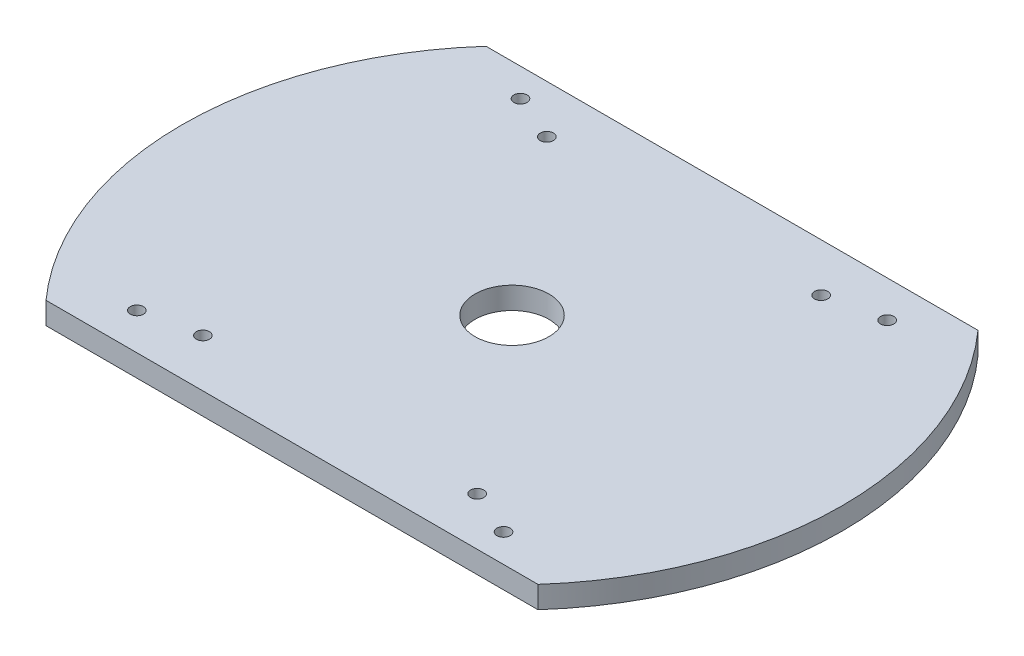
ISO-10303-21;
HEADER;
FILE_DESCRIPTION(('STEP AP214'),'2;1');
FILE_NAME('part.step','',(''),(''),'','','');
FILE_SCHEMA(('AUTOMOTIVE_DESIGN { 1 0 10303 214 1 1 1 1 }'));
ENDSEC;
DATA;
#1=APPLICATION_CONTEXT('core data for automotive mechanical design processes');
#2=APPLICATION_PROTOCOL_DEFINITION('international standard','automotive_design',2000,#1);
#3=PRODUCT_CONTEXT('',#1,'mechanical');
#4=PRODUCT('Part','Part','',(#3));
#5=PRODUCT_RELATED_PRODUCT_CATEGORY('part','',(#4));
#6=PRODUCT_DEFINITION_FORMATION('','',#4);
#7=PRODUCT_DEFINITION_CONTEXT('part definition',#1,'design');
#8=PRODUCT_DEFINITION('design','',#6,#7);
#9=PRODUCT_DEFINITION_SHAPE('','',#8);
#10=(LENGTH_UNIT() NAMED_UNIT(*) SI_UNIT(.MILLI.,.METRE.));
#11=(NAMED_UNIT(*) PLANE_ANGLE_UNIT() SI_UNIT($,.RADIAN.));
#12=(NAMED_UNIT(*) SI_UNIT($,.STERADIAN.) SOLID_ANGLE_UNIT());
#13=UNCERTAINTY_MEASURE_WITH_UNIT(LENGTH_MEASURE(1.E-05),#10,'distance_accuracy_value','');
#14=(GEOMETRIC_REPRESENTATION_CONTEXT(3) GLOBAL_UNCERTAINTY_ASSIGNED_CONTEXT((#13)) GLOBAL_UNIT_ASSIGNED_CONTEXT((#10,
#11,#12)) REPRESENTATION_CONTEXT('',''));
#15=CARTESIAN_POINT('',(0.,0.,0.));
#16=DIRECTION('',(0.,0.,1.));
#17=DIRECTION('',(1.,0.,0.));
#18=AXIS2_PLACEMENT_3D('',#15,#16,#17);
#19=CARTESIAN_POINT('',(0.,5.,0.));
#20=DIRECTION('',(0.,-1.,0.));
#21=DIRECTION('',(0.,0.,-1.));
#22=AXIS2_PLACEMENT_3D('',#19,#20,#21);
#23=CYLINDRICAL_SURFACE('',#22,75.);
#24=DIRECTION('',(0.,1.,0.));
#25=VECTOR('',#24,1.);
#26=CARTESIAN_POINT('',(55.9016994374948,-5.,-50.));
#27=LINE('',#26,#25);
#28=CARTESIAN_POINT('',(55.9016994374948,0.,-50.));
#29=VERTEX_POINT('',#28);
#30=CARTESIAN_POINT('',(55.9016994374948,5.,-50.));
#31=VERTEX_POINT('',#30);
#32=EDGE_CURVE('E64',#29,#31,#27,.T.);
#33=ORIENTED_EDGE('',*,*,#32,.T.);
#34=CARTESIAN_POINT('',(0.,5.,0.));
#35=DIRECTION('',(0.,1.,0.));
#36=DIRECTION('',(0.,0.,1.));
#37=AXIS2_PLACEMENT_3D('',#34,#35,#36);
#38=CIRCLE('',#37,75.);
#39=CARTESIAN_POINT('',(55.9016994374948,5.,50.));
#40=VERTEX_POINT('',#39);
#41=EDGE_CURVE('E95',#40,#31,#38,.T.);
#42=ORIENTED_EDGE('',*,*,#41,.F.);
#43=DIRECTION('',(0.,1.,0.));
#44=VECTOR('',#43,1.);
#45=CARTESIAN_POINT('',(55.9016994374948,-5.,50.));
#46=LINE('',#45,#44);
#47=CARTESIAN_POINT('',(55.9016994374948,0.,50.));
#48=VERTEX_POINT('',#47);
#49=EDGE_CURVE('E89',#48,#40,#46,.T.);
#50=ORIENTED_EDGE('',*,*,#49,.F.);
#51=CARTESIAN_POINT('',(0.,0.,0.));
#52=DIRECTION('',(0.,1.,0.));
#53=DIRECTION('',(0.,0.,1.));
#54=AXIS2_PLACEMENT_3D('',#51,#52,#53);
#55=CIRCLE('',#54,75.);
#56=EDGE_CURVE('E97',#48,#29,#55,.T.);
#57=ORIENTED_EDGE('',*,*,#56,.T.);
#58=EDGE_LOOP('',(#33,#42,#50,#57));
#59=FACE_BOUND('',#58,.T.);
#60=ADVANCED_FACE('F41',(#59),#23,.T.);
#61=DIRECTION('',(0.,1.,0.));
#62=VECTOR('',#61,1.);
#63=CARTESIAN_POINT('',(-55.9016994374948,-5.,-50.));
#64=LINE('',#63,#62);
#65=CARTESIAN_POINT('',(-55.9016994374948,0.,-50.));
#66=VERTEX_POINT('',#65);
#67=CARTESIAN_POINT('',(-55.9016994374948,5.,-50.));
#68=VERTEX_POINT('',#67);
#69=EDGE_CURVE('E83',#66,#68,#64,.T.);
#70=ORIENTED_EDGE('',*,*,#69,.F.);
#71=CARTESIAN_POINT('',(-55.9016994374948,0.,50.));
#72=VERTEX_POINT('',#71);
#73=EDGE_CURVE('E147',#66,#72,#55,.T.);
#74=ORIENTED_EDGE('',*,*,#73,.T.);
#75=DIRECTION('',(0.,1.,0.));
#76=VECTOR('',#75,1.);
#77=CARTESIAN_POINT('',(-55.9016994374948,-5.,50.));
#78=LINE('',#77,#76);
#79=CARTESIAN_POINT('',(-55.9016994374948,5.,50.));
#80=VERTEX_POINT('',#79);
#81=EDGE_CURVE('E57',#72,#80,#78,.T.);
#82=ORIENTED_EDGE('',*,*,#81,.T.);
#83=EDGE_CURVE('E105',#68,#80,#38,.T.);
#84=ORIENTED_EDGE('',*,*,#83,.F.);
#85=EDGE_LOOP('',(#70,#74,#82,#84));
#86=FACE_BOUND('',#85,.T.);
#87=ADVANCED_FACE('F167',(#86),#23,.T.);
#88=CARTESIAN_POINT('',(0.,5.,0.));
#89=DIRECTION('',(0.,1.,0.));
#90=DIRECTION('',(0.,0.,1.));
#91=AXIS2_PLACEMENT_3D('',#88,#89,#90);
#92=PLANE('',#91);
#93=CARTESIAN_POINT('',(31.164692583251,5.,-39.0906342227684));
#94=DIRECTION('',(0.,1.,0.));
#95=DIRECTION('',(0.,0.,1.));
#96=AXIS2_PLACEMENT_3D('',#93,#94,#95);
#97=CIRCLE('',#96,1.5);
#98=CARTESIAN_POINT('',(31.164692583251,5.,-37.5906342227684));
#99=VERTEX_POINT('',#98);
#100=EDGE_CURVE('E157',#99,#99,#97,.F.);
#101=ORIENTED_EDGE('',*,*,#100,.T.);
#102=EDGE_LOOP('',(#101));
#103=FACE_BOUND('',#102,.T.);
#104=CARTESIAN_POINT('',(0.,5.,0.));
#105=DIRECTION('',(0.,1.,0.));
#106=DIRECTION('',(0.,0.,1.));
#107=AXIS2_PLACEMENT_3D('',#104,#105,#106);
#108=CIRCLE('',#107,8.4);
#109=CARTESIAN_POINT('',(0.,5.,8.4));
#110=VERTEX_POINT('',#109);
#111=EDGE_CURVE('E178',#110,#110,#108,.T.);
#112=ORIENTED_EDGE('',*,*,#111,.F.);
#113=EDGE_LOOP('',(#112));
#114=FACE_BOUND('',#113,.T.);
#115=CARTESIAN_POINT('',(-31.164692583251,5.,-39.0906342227684));
#116=DIRECTION('',(0.,1.,0.));
#117=DIRECTION('',(0.,0.,1.));
#118=AXIS2_PLACEMENT_3D('',#115,#116,#117);
#119=CIRCLE('',#118,1.5);
#120=CARTESIAN_POINT('',(-31.164692583251,5.,-37.5906342227684));
#121=VERTEX_POINT('',#120);
#122=EDGE_CURVE('E182',#121,#121,#119,.T.);
#123=ORIENTED_EDGE('',*,*,#122,.F.);
#124=EDGE_LOOP('',(#123));
#125=FACE_BOUND('',#124,.T.);
#126=CARTESIAN_POINT('',(-43.590634222766,5.,41.664692583251));
#127=DIRECTION('',(0.,1.,0.));
#128=DIRECTION('',(0.,0.,1.));
#129=AXIS2_PLACEMENT_3D('',#126,#127,#128);
#130=CIRCLE('',#129,1.50000000000133);
#131=CARTESIAN_POINT('',(-43.590634222766,5.,43.1646925832524));
#132=VERTEX_POINT('',#131);
#133=EDGE_CURVE('E186',#132,#132,#130,.T.);
#134=ORIENTED_EDGE('',*,*,#133,.F.);
#135=EDGE_LOOP('',(#134));
#136=FACE_BOUND('',#135,.T.);
#137=CARTESIAN_POINT('',(41.6646925832535,5.,43.5906342227661));
#138=DIRECTION('',(0.,1.,0.));
#139=DIRECTION('',(0.,0.,1.));
#140=AXIS2_PLACEMENT_3D('',#137,#138,#139);
#141=CIRCLE('',#140,1.50000000000344);
#142=CARTESIAN_POINT('',(41.6646925832535,5.,45.0906342227695));
#143=VERTEX_POINT('',#142);
#144=EDGE_CURVE('E190',#143,#143,#141,.T.);
#145=ORIENTED_EDGE('',*,*,#144,.F.);
#146=EDGE_LOOP('',(#145));
#147=FACE_BOUND('',#146,.T.);
#148=CARTESIAN_POINT('',(43.5906342227685,5.,-41.6646925832534));
#149=DIRECTION('',(0.,1.,0.));
#150=DIRECTION('',(0.,0.,1.));
#151=AXIS2_PLACEMENT_3D('',#148,#149,#150);
#152=CIRCLE('',#151,1.5000000000025);
#153=CARTESIAN_POINT('',(43.5906342227685,5.,-40.1646925832509));
#154=VERTEX_POINT('',#153);
#155=EDGE_CURVE('E193',#154,#154,#152,.T.);
#156=ORIENTED_EDGE('',*,*,#155,.F.);
#157=EDGE_LOOP('',(#156));
#158=FACE_BOUND('',#157,.T.);
#159=CARTESIAN_POINT('',(-41.664692583251,5.,-43.5906342227684));
#160=DIRECTION('',(0.,1.,0.));
#161=DIRECTION('',(0.,0.,1.));
#162=AXIS2_PLACEMENT_3D('',#159,#160,#161);
#163=CIRCLE('',#162,1.5);
#164=CARTESIAN_POINT('',(-41.664692583251,5.,-42.0906342227684));
#165=VERTEX_POINT('',#164);
#166=EDGE_CURVE('E112',#165,#165,#163,.T.);
#167=ORIENTED_EDGE('',*,*,#166,.F.);
#168=EDGE_LOOP('',(#167));
#169=FACE_BOUND('',#168,.T.);
#170=CARTESIAN_POINT('',(31.164692583251,5.,39.0906342227684));
#171=DIRECTION('',(0.,1.,0.));
#172=DIRECTION('',(0.,0.,1.));
#173=AXIS2_PLACEMENT_3D('',#170,#171,#172);
#174=CIRCLE('',#173,1.5);
#175=CARTESIAN_POINT('',(31.164692583251,5.,40.5906342227684));
#176=VERTEX_POINT('',#175);
#177=EDGE_CURVE('E104',#176,#176,#174,.T.);
#178=ORIENTED_EDGE('',*,*,#177,.F.);
#179=EDGE_LOOP('',(#178));
#180=FACE_BOUND('',#179,.T.);
#181=CARTESIAN_POINT('',(-31.164692583251,5.,39.0906342227684));
#182=DIRECTION('',(0.,1.,0.));
#183=DIRECTION('',(0.,0.,1.));
#184=AXIS2_PLACEMENT_3D('',#181,#182,#183);
#185=CIRCLE('',#184,1.5);
#186=CARTESIAN_POINT('',(-31.164692583251,5.,40.5906342227684));
#187=VERTEX_POINT('',#186);
#188=EDGE_CURVE('E110',#187,#187,#185,.F.);
#189=ORIENTED_EDGE('',*,*,#188,.T.);
#190=EDGE_LOOP('',(#189));
#191=FACE_BOUND('',#190,.T.);
#192=ORIENTED_EDGE('',*,*,#41,.T.);
#193=DIRECTION('',(-1.,0.,0.));
#194=VECTOR('',#193,1.);
#195=CARTESIAN_POINT('',(0.,5.,-50.));
#196=LINE('',#195,#194);
#197=EDGE_CURVE('E80',#31,#68,#196,.T.);
#198=ORIENTED_EDGE('',*,*,#197,.T.);
#199=ORIENTED_EDGE('',*,*,#83,.T.);
#200=DIRECTION('',(1.,0.,0.));
#201=VECTOR('',#200,1.);
#202=CARTESIAN_POINT('',(0.,5.,50.));
#203=LINE('',#202,#201);
#204=EDGE_CURVE('E102',#80,#40,#203,.T.);
#205=ORIENTED_EDGE('',*,*,#204,.T.);
#206=EDGE_LOOP('',(#192,#198,#199,#205));
#207=FACE_BOUND('',#206,.T.);
#208=ADVANCED_FACE('F101',(#103,#114,#125,#136,#147,#158,#169,#180,#191,#207),#92,.T.);
#209=CARTESIAN_POINT('',(0.,0.,0.));
#210=DIRECTION('',(0.,1.,0.));
#211=DIRECTION('',(0.,0.,1.));
#212=AXIS2_PLACEMENT_3D('',#209,#210,#211);
#213=PLANE('',#212);
#214=CARTESIAN_POINT('',(31.164692583251,0.,-39.0906342227684));
#215=DIRECTION('',(0.,1.,0.));
#216=DIRECTION('',(0.,0.,1.));
#217=AXIS2_PLACEMENT_3D('',#214,#215,#216);
#218=CIRCLE('',#217,1.5);
#219=CARTESIAN_POINT('',(31.164692583251,0.,-37.5906342227684));
#220=VERTEX_POINT('',#219);
#221=EDGE_CURVE('E119',#220,#220,#218,.F.);
#222=ORIENTED_EDGE('',*,*,#221,.F.);
#223=EDGE_LOOP('',(#222));
#224=FACE_BOUND('',#223,.T.);
#225=CARTESIAN_POINT('',(0.,0.,0.));
#226=DIRECTION('',(0.,1.,0.));
#227=DIRECTION('',(0.,0.,1.));
#228=AXIS2_PLACEMENT_3D('',#225,#226,#227);
#229=CIRCLE('',#228,8.4);
#230=CARTESIAN_POINT('',(0.,0.,8.4));
#231=VERTEX_POINT('',#230);
#232=EDGE_CURVE('E123',#231,#231,#229,.T.);
#233=ORIENTED_EDGE('',*,*,#232,.T.);
#234=EDGE_LOOP('',(#233));
#235=FACE_BOUND('',#234,.T.);
#236=CARTESIAN_POINT('',(-31.164692583251,0.,-39.0906342227684));
#237=DIRECTION('',(0.,1.,0.));
#238=DIRECTION('',(0.,0.,1.));
#239=AXIS2_PLACEMENT_3D('',#236,#237,#238);
#240=CIRCLE('',#239,1.5);
#241=CARTESIAN_POINT('',(-31.164692583251,0.,-37.5906342227684));
#242=VERTEX_POINT('',#241);
#243=EDGE_CURVE('E127',#242,#242,#240,.T.);
#244=ORIENTED_EDGE('',*,*,#243,.T.);
#245=EDGE_LOOP('',(#244));
#246=FACE_BOUND('',#245,.T.);
#247=CARTESIAN_POINT('',(-43.590634222766,0.,41.664692583251));
#248=DIRECTION('',(0.,1.,0.));
#249=DIRECTION('',(0.,0.,1.));
#250=AXIS2_PLACEMENT_3D('',#247,#248,#249);
#251=CIRCLE('',#250,1.50000000000133);
#252=CARTESIAN_POINT('',(-43.590634222766,0.,43.1646925832524));
#253=VERTEX_POINT('',#252);
#254=EDGE_CURVE('E131',#253,#253,#251,.T.);
#255=ORIENTED_EDGE('',*,*,#254,.T.);
#256=EDGE_LOOP('',(#255));
#257=FACE_BOUND('',#256,.T.);
#258=CARTESIAN_POINT('',(41.6646925832535,0.,43.5906342227661));
#259=DIRECTION('',(0.,1.,0.));
#260=DIRECTION('',(0.,0.,1.));
#261=AXIS2_PLACEMENT_3D('',#258,#259,#260);
#262=CIRCLE('',#261,1.50000000000344);
#263=CARTESIAN_POINT('',(41.6646925832535,0.,45.0906342227695));
#264=VERTEX_POINT('',#263);
#265=EDGE_CURVE('E135',#264,#264,#262,.T.);
#266=ORIENTED_EDGE('',*,*,#265,.T.);
#267=EDGE_LOOP('',(#266));
#268=FACE_BOUND('',#267,.T.);
#269=CARTESIAN_POINT('',(43.5906342227685,0.,-41.6646925832534));
#270=DIRECTION('',(0.,1.,0.));
#271=DIRECTION('',(0.,0.,1.));
#272=AXIS2_PLACEMENT_3D('',#269,#270,#271);
#273=CIRCLE('',#272,1.5000000000025);
#274=CARTESIAN_POINT('',(43.5906342227685,0.,-40.1646925832509));
#275=VERTEX_POINT('',#274);
#276=EDGE_CURVE('E139',#275,#275,#273,.T.);
#277=ORIENTED_EDGE('',*,*,#276,.T.);
#278=EDGE_LOOP('',(#277));
#279=FACE_BOUND('',#278,.T.);
#280=CARTESIAN_POINT('',(-41.664692583251,0.,-43.5906342227684));
#281=DIRECTION('',(0.,1.,0.));
#282=DIRECTION('',(0.,0.,1.));
#283=AXIS2_PLACEMENT_3D('',#280,#281,#282);
#284=CIRCLE('',#283,1.5);
#285=CARTESIAN_POINT('',(-41.664692583251,0.,-42.0906342227684));
#286=VERTEX_POINT('',#285);
#287=EDGE_CURVE('E143',#286,#286,#284,.T.);
#288=ORIENTED_EDGE('',*,*,#287,.T.);
#289=EDGE_LOOP('',(#288));
#290=FACE_BOUND('',#289,.T.);
#291=CARTESIAN_POINT('',(31.164692583251,0.,39.0906342227684));
#292=DIRECTION('',(0.,1.,0.));
#293=DIRECTION('',(0.,0.,1.));
#294=AXIS2_PLACEMENT_3D('',#291,#292,#293);
#295=CIRCLE('',#294,1.5);
#296=CARTESIAN_POINT('',(31.164692583251,0.,40.5906342227684));
#297=VERTEX_POINT('',#296);
#298=EDGE_CURVE('E150',#297,#297,#295,.T.);
#299=ORIENTED_EDGE('',*,*,#298,.T.);
#300=EDGE_LOOP('',(#299));
#301=FACE_BOUND('',#300,.T.);
#302=CARTESIAN_POINT('',(-31.164692583251,0.,39.0906342227684));
#303=DIRECTION('',(0.,1.,0.));
#304=DIRECTION('',(0.,0.,1.));
#305=AXIS2_PLACEMENT_3D('',#302,#303,#304);
#306=CIRCLE('',#305,1.5);
#307=CARTESIAN_POINT('',(-31.164692583251,0.,40.5906342227684));
#308=VERTEX_POINT('',#307);
#309=EDGE_CURVE('E154',#308,#308,#306,.F.);
#310=ORIENTED_EDGE('',*,*,#309,.F.);
#311=EDGE_LOOP('',(#310));
#312=FACE_BOUND('',#311,.T.);
#313=DIRECTION('',(-1.,0.,0.));
#314=VECTOR('',#313,1.);
#315=CARTESIAN_POINT('',(0.,0.,-50.));
#316=LINE('',#315,#314);
#317=EDGE_CURVE('E11',#29,#66,#316,.T.);
#318=ORIENTED_EDGE('',*,*,#317,.F.);
#319=ORIENTED_EDGE('',*,*,#56,.F.);
#320=DIRECTION('',(1.,0.,0.));
#321=VECTOR('',#320,1.);
#322=CARTESIAN_POINT('',(0.,0.,50.));
#323=LINE('',#322,#321);
#324=EDGE_CURVE('E50',#72,#48,#323,.T.);
#325=ORIENTED_EDGE('',*,*,#324,.F.);
#326=ORIENTED_EDGE('',*,*,#73,.F.);
#327=EDGE_LOOP('',(#318,#319,#325,#326));
#328=FACE_BOUND('',#327,.T.);
#329=ADVANCED_FACE('F165',(#224,#235,#246,#257,#268,#279,#290,#301,#312,#328),#213,.F.);
#330=CARTESIAN_POINT('',(31.164692583251,5.,39.0906342227684));
#331=DIRECTION('',(0.,-1.,0.));
#332=DIRECTION('',(0.,0.,-1.));
#333=AXIS2_PLACEMENT_3D('',#330,#331,#332);
#334=CYLINDRICAL_SURFACE('',#333,1.5);
#335=ORIENTED_EDGE('',*,*,#177,.T.);
#336=EDGE_LOOP('',(#335));
#337=FACE_BOUND('',#336,.T.);
#338=ORIENTED_EDGE('',*,*,#298,.F.);
#339=EDGE_LOOP('',(#338));
#340=FACE_BOUND('',#339,.T.);
#341=ADVANCED_FACE('F220',(#337,#340),#334,.F.);
#342=CARTESIAN_POINT('',(-41.664692583251,5.,-43.5906342227684));
#343=DIRECTION('',(0.,-1.,0.));
#344=DIRECTION('',(0.,0.,-1.));
#345=AXIS2_PLACEMENT_3D('',#342,#343,#344);
#346=CYLINDRICAL_SURFACE('',#345,1.5);
#347=ORIENTED_EDGE('',*,*,#166,.T.);
#348=EDGE_LOOP('',(#347));
#349=FACE_BOUND('',#348,.T.);
#350=ORIENTED_EDGE('',*,*,#287,.F.);
#351=EDGE_LOOP('',(#350));
#352=FACE_BOUND('',#351,.T.);
#353=ADVANCED_FACE('F202',(#349,#352),#346,.F.);
#354=CARTESIAN_POINT('',(43.5906342227685,5.,-41.6646925832534));
#355=DIRECTION('',(0.,-1.,0.));
#356=DIRECTION('',(0.,0.,-1.));
#357=AXIS2_PLACEMENT_3D('',#354,#355,#356);
#358=CYLINDRICAL_SURFACE('',#357,1.5000000000025);
#359=ORIENTED_EDGE('',*,*,#155,.T.);
#360=EDGE_LOOP('',(#359));
#361=FACE_BOUND('',#360,.T.);
#362=ORIENTED_EDGE('',*,*,#276,.F.);
#363=EDGE_LOOP('',(#362));
#364=FACE_BOUND('',#363,.T.);
#365=ADVANCED_FACE('F238',(#361,#364),#358,.F.);
#366=CARTESIAN_POINT('',(41.6646925832535,5.,43.5906342227661));
#367=DIRECTION('',(0.,-1.,0.));
#368=DIRECTION('',(0.,0.,-1.));
#369=AXIS2_PLACEMENT_3D('',#366,#367,#368);
#370=CYLINDRICAL_SURFACE('',#369,1.50000000000344);
#371=ORIENTED_EDGE('',*,*,#144,.T.);
#372=EDGE_LOOP('',(#371));
#373=FACE_BOUND('',#372,.T.);
#374=ORIENTED_EDGE('',*,*,#265,.F.);
#375=EDGE_LOOP('',(#374));
#376=FACE_BOUND('',#375,.T.);
#377=ADVANCED_FACE('F241',(#373,#376),#370,.F.);
#378=CARTESIAN_POINT('',(-43.590634222766,5.,41.664692583251));
#379=DIRECTION('',(0.,-1.,0.));
#380=DIRECTION('',(0.,0.,-1.));
#381=AXIS2_PLACEMENT_3D('',#378,#379,#380);
#382=CYLINDRICAL_SURFACE('',#381,1.50000000000133);
#383=ORIENTED_EDGE('',*,*,#133,.T.);
#384=EDGE_LOOP('',(#383));
#385=FACE_BOUND('',#384,.T.);
#386=ORIENTED_EDGE('',*,*,#254,.F.);
#387=EDGE_LOOP('',(#386));
#388=FACE_BOUND('',#387,.T.);
#389=ADVANCED_FACE('F244',(#385,#388),#382,.F.);
#390=CARTESIAN_POINT('',(-31.164692583251,5.,-39.0906342227684));
#391=DIRECTION('',(0.,-1.,0.));
#392=DIRECTION('',(0.,0.,-1.));
#393=AXIS2_PLACEMENT_3D('',#390,#391,#392);
#394=CYLINDRICAL_SURFACE('',#393,1.5);
#395=ORIENTED_EDGE('',*,*,#122,.T.);
#396=EDGE_LOOP('',(#395));
#397=FACE_BOUND('',#396,.T.);
#398=ORIENTED_EDGE('',*,*,#243,.F.);
#399=EDGE_LOOP('',(#398));
#400=FACE_BOUND('',#399,.T.);
#401=ADVANCED_FACE('F248',(#397,#400),#394,.F.);
#402=CARTESIAN_POINT('',(0.,5.,0.));
#403=DIRECTION('',(0.,-1.,0.));
#404=DIRECTION('',(0.,0.,-1.));
#405=AXIS2_PLACEMENT_3D('',#402,#403,#404);
#406=CYLINDRICAL_SURFACE('',#405,8.4);
#407=ORIENTED_EDGE('',*,*,#111,.T.);
#408=EDGE_LOOP('',(#407));
#409=FACE_BOUND('',#408,.T.);
#410=ORIENTED_EDGE('',*,*,#232,.F.);
#411=EDGE_LOOP('',(#410));
#412=FACE_BOUND('',#411,.T.);
#413=ADVANCED_FACE('F251',(#409,#412),#406,.F.);
#414=CARTESIAN_POINT('',(31.164692583251,5.,-39.0906342227684));
#415=DIRECTION('',(0.,-1.,0.));
#416=DIRECTION('',(0.,0.,-1.));
#417=AXIS2_PLACEMENT_3D('',#414,#415,#416);
#418=CYLINDRICAL_SURFACE('',#417,1.5);
#419=ORIENTED_EDGE('',*,*,#100,.F.);
#420=EDGE_LOOP('',(#419));
#421=FACE_BOUND('',#420,.T.);
#422=ORIENTED_EDGE('',*,*,#221,.T.);
#423=EDGE_LOOP('',(#422));
#424=FACE_BOUND('',#423,.T.);
#425=ADVANCED_FACE('F43',(#421,#424),#418,.F.);
#426=CARTESIAN_POINT('',(-31.164692583251,5.,39.0906342227684));
#427=DIRECTION('',(0.,-1.,0.));
#428=DIRECTION('',(0.,0.,-1.));
#429=AXIS2_PLACEMENT_3D('',#426,#427,#428);
#430=CYLINDRICAL_SURFACE('',#429,1.5);
#431=ORIENTED_EDGE('',*,*,#188,.F.);
#432=EDGE_LOOP('',(#431));
#433=FACE_BOUND('',#432,.T.);
#434=ORIENTED_EDGE('',*,*,#309,.T.);
#435=EDGE_LOOP('',(#434));
#436=FACE_BOUND('',#435,.T.);
#437=ADVANCED_FACE('F213',(#433,#436),#430,.F.);
#438=CARTESIAN_POINT('',(0.,-5.,50.));
#439=DIRECTION('',(0.,0.,1.));
#440=DIRECTION('',(1.,0.,0.));
#441=AXIS2_PLACEMENT_3D('',#438,#439,#440);
#442=PLANE('',#441);
#443=ORIENTED_EDGE('',*,*,#324,.T.);
#444=ORIENTED_EDGE('',*,*,#49,.T.);
#445=ORIENTED_EDGE('',*,*,#204,.F.);
#446=ORIENTED_EDGE('',*,*,#81,.F.);
#447=EDGE_LOOP('',(#443,#444,#445,#446));
#448=FACE_BOUND('',#447,.T.);
#449=ADVANCED_FACE('F159',(#448),#442,.T.);
#450=CARTESIAN_POINT('',(0.,-5.,-50.));
#451=DIRECTION('',(0.,0.,-1.));
#452=DIRECTION('',(-1.,0.,0.));
#453=AXIS2_PLACEMENT_3D('',#450,#451,#452);
#454=PLANE('',#453);
#455=ORIENTED_EDGE('',*,*,#317,.T.);
#456=ORIENTED_EDGE('',*,*,#69,.T.);
#457=ORIENTED_EDGE('',*,*,#197,.F.);
#458=ORIENTED_EDGE('',*,*,#32,.F.);
#459=EDGE_LOOP('',(#455,#456,#457,#458));
#460=FACE_BOUND('',#459,.T.);
#461=ADVANCED_FACE('F81',(#460),#454,.T.);
#462=CLOSED_SHELL('',(#60,#87,#208,#329,#341,#353,#365,#377,#389,#401,#413,#425,#437,#449,#461));
#463=MANIFOLD_SOLID_BREP('B2',#462);
#464=ADVANCED_BREP_SHAPE_REPRESENTATION('',(#18,#463),#14);
#465=SHAPE_DEFINITION_REPRESENTATION(#9,#464);
ENDSEC;
END-ISO-10303-21;
